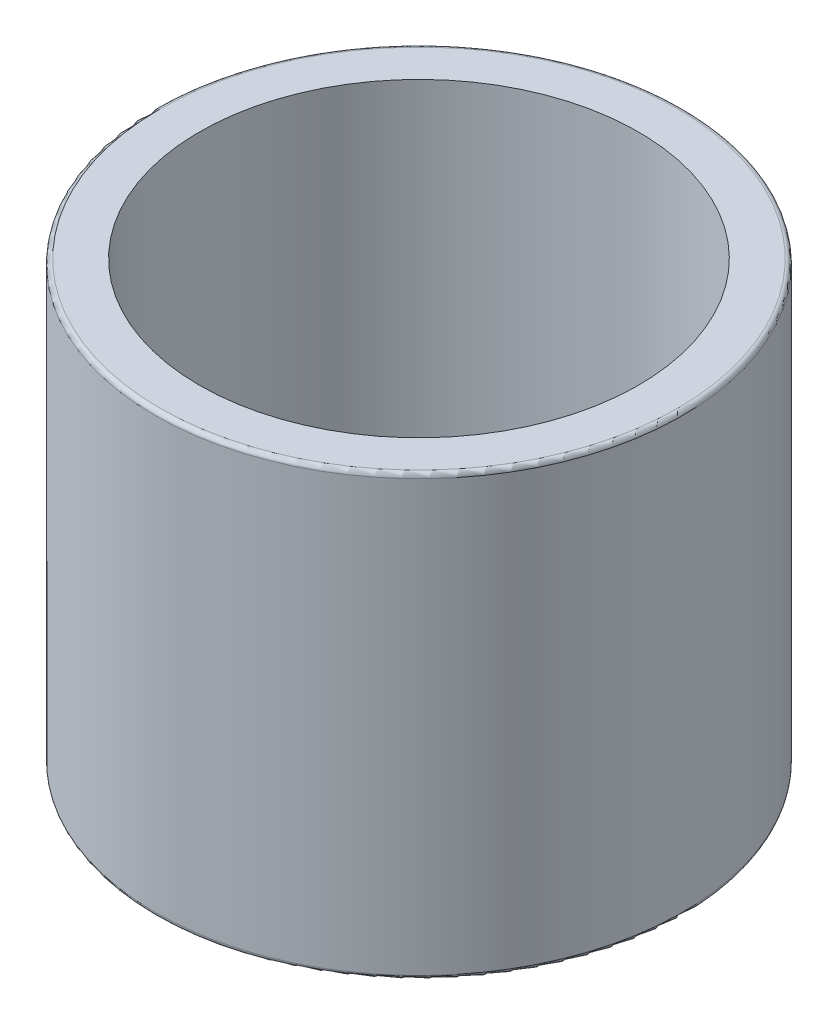
ISO-10303-21;
HEADER;
FILE_DESCRIPTION(('STEP AP214'),'2;1');
FILE_NAME('part.step','',(''),(''),'','','');
FILE_SCHEMA(('AUTOMOTIVE_DESIGN { 1 0 10303 214 1 1 1 1 }'));
ENDSEC;
DATA;
#1=APPLICATION_CONTEXT('core data for automotive mechanical design processes');
#2=APPLICATION_PROTOCOL_DEFINITION('international standard','automotive_design',2000,#1);
#3=PRODUCT_CONTEXT('',#1,'mechanical');
#4=PRODUCT('Part','Part','',(#3));
#5=PRODUCT_RELATED_PRODUCT_CATEGORY('part','',(#4));
#6=PRODUCT_DEFINITION_FORMATION('','',#4);
#7=PRODUCT_DEFINITION_CONTEXT('part definition',#1,'design');
#8=PRODUCT_DEFINITION('design','',#6,#7);
#9=PRODUCT_DEFINITION_SHAPE('','',#8);
#10=(LENGTH_UNIT() NAMED_UNIT(*) SI_UNIT(.MILLI.,.METRE.));
#11=(NAMED_UNIT(*) PLANE_ANGLE_UNIT() SI_UNIT($,.RADIAN.));
#12=(NAMED_UNIT(*) SI_UNIT($,.STERADIAN.) SOLID_ANGLE_UNIT());
#13=UNCERTAINTY_MEASURE_WITH_UNIT(LENGTH_MEASURE(1.E-05),#10,'distance_accuracy_value','');
#14=(GEOMETRIC_REPRESENTATION_CONTEXT(3) GLOBAL_UNCERTAINTY_ASSIGNED_CONTEXT((#13)) GLOBAL_UNIT_ASSIGNED_CONTEXT((#10,
#11,#12)) REPRESENTATION_CONTEXT('',''));
#15=CARTESIAN_POINT('',(0.,0.,0.));
#16=DIRECTION('',(0.,0.,1.));
#17=DIRECTION('',(1.,0.,0.));
#18=AXIS2_PLACEMENT_3D('',#15,#16,#17);
#19=CARTESIAN_POINT('',(0.,5.,0.));
#20=DIRECTION('',(0.,1.,0.));
#21=DIRECTION('',(0.,0.,1.));
#22=AXIS2_PLACEMENT_3D('',#19,#20,#21);
#23=PLANE('',#22);
#24=CARTESIAN_POINT('',(0.,5.,0.));
#25=DIRECTION('',(0.,1.,0.));
#26=DIRECTION('',(0.,0.,1.));
#27=AXIS2_PLACEMENT_3D('',#24,#25,#26);
#28=CIRCLE('',#27,5.9);
#29=CARTESIAN_POINT('',(0.,5.,5.9));
#30=VERTEX_POINT('',#29);
#31=EDGE_CURVE('E10',#30,#30,#28,.T.);
#32=ORIENTED_EDGE('',*,*,#31,.T.);
#33=EDGE_LOOP('',(#32));
#34=FACE_BOUND('',#33,.T.);
#35=CARTESIAN_POINT('',(0.,5.,0.));
#36=DIRECTION('',(0.,1.,0.));
#37=DIRECTION('',(0.,0.,1.));
#38=AXIS2_PLACEMENT_3D('',#35,#36,#37);
#39=CIRCLE('',#38,5.);
#40=CARTESIAN_POINT('',(0.,5.,5.));
#41=VERTEX_POINT('',#40);
#42=EDGE_CURVE('E53',#41,#41,#39,.T.);
#43=ORIENTED_EDGE('',*,*,#42,.F.);
#44=EDGE_LOOP('',(#43));
#45=FACE_BOUND('',#44,.T.);
#46=ADVANCED_FACE('F33',(#34,#45),#23,.T.);
#47=CARTESIAN_POINT('',(0.,-5.,0.));
#48=DIRECTION('',(0.,1.,0.));
#49=DIRECTION('',(0.,0.,1.));
#50=AXIS2_PLACEMENT_3D('',#47,#48,#49);
#51=PLANE('',#50);
#52=CARTESIAN_POINT('',(0.,-5.,0.));
#53=DIRECTION('',(0.,1.,0.));
#54=DIRECTION('',(0.,0.,1.));
#55=AXIS2_PLACEMENT_3D('',#52,#53,#54);
#56=CIRCLE('',#55,5.9);
#57=CARTESIAN_POINT('',(0.,-5.,5.9));
#58=VERTEX_POINT('',#57);
#59=EDGE_CURVE('E40',#58,#58,#56,.F.);
#60=ORIENTED_EDGE('',*,*,#59,.T.);
#61=EDGE_LOOP('',(#60));
#62=FACE_BOUND('',#61,.T.);
#63=CARTESIAN_POINT('',(0.,-5.,0.));
#64=DIRECTION('',(0.,1.,0.));
#65=DIRECTION('',(0.,0.,1.));
#66=AXIS2_PLACEMENT_3D('',#63,#64,#65);
#67=CIRCLE('',#66,5.);
#68=CARTESIAN_POINT('',(0.,-5.,5.));
#69=VERTEX_POINT('',#68);
#70=EDGE_CURVE('E54',#69,#69,#67,.T.);
#71=ORIENTED_EDGE('',*,*,#70,.T.);
#72=EDGE_LOOP('',(#71));
#73=FACE_BOUND('',#72,.T.);
#74=ADVANCED_FACE('F64',(#62,#73),#51,.F.);
#75=CARTESIAN_POINT('',(0.,5.,0.));
#76=DIRECTION('',(0.,-1.,0.));
#77=DIRECTION('',(0.,0.,-1.));
#78=AXIS2_PLACEMENT_3D('',#75,#76,#77);
#79=CYLINDRICAL_SURFACE('',#78,6.);
#80=CARTESIAN_POINT('',(0.,-4.9,0.));
#81=DIRECTION('',(0.,1.,0.));
#82=DIRECTION('',(0.,0.,1.));
#83=AXIS2_PLACEMENT_3D('',#80,#81,#82);
#84=CIRCLE('',#83,6.);
#85=CARTESIAN_POINT('',(0.,-4.9,6.));
#86=VERTEX_POINT('',#85);
#87=EDGE_CURVE('E44',#86,#86,#84,.T.);
#88=ORIENTED_EDGE('',*,*,#87,.T.);
#89=EDGE_LOOP('',(#88));
#90=FACE_BOUND('',#89,.T.);
#91=CARTESIAN_POINT('',(0.,4.9,0.));
#92=DIRECTION('',(0.,1.,0.));
#93=DIRECTION('',(0.,0.,1.));
#94=AXIS2_PLACEMENT_3D('',#91,#92,#93);
#95=CIRCLE('',#94,6.);
#96=CARTESIAN_POINT('',(0.,4.9,6.));
#97=VERTEX_POINT('',#96);
#98=EDGE_CURVE('E48',#97,#97,#95,.F.);
#99=ORIENTED_EDGE('',*,*,#98,.T.);
#100=EDGE_LOOP('',(#99));
#101=FACE_BOUND('',#100,.T.);
#102=ADVANCED_FACE('F69',(#90,#101),#79,.T.);
#103=CARTESIAN_POINT('',(0.,5.,0.));
#104=DIRECTION('',(0.,-1.,0.));
#105=DIRECTION('',(0.,0.,-1.));
#106=AXIS2_PLACEMENT_3D('',#103,#104,#105);
#107=CYLINDRICAL_SURFACE('',#106,5.);
#108=ORIENTED_EDGE('',*,*,#42,.T.);
#109=EDGE_LOOP('',(#108));
#110=FACE_BOUND('',#109,.T.);
#111=ORIENTED_EDGE('',*,*,#70,.F.);
#112=EDGE_LOOP('',(#111));
#113=FACE_BOUND('',#112,.T.);
#114=ADVANCED_FACE('F60',(#110,#113),#107,.F.);
#115=CARTESIAN_POINT('',(0.,-4.9,0.));
#116=DIRECTION('',(0.,1.,0.));
#117=DIRECTION('',(0.,0.,1.));
#118=AXIS2_PLACEMENT_3D('',#115,#116,#117);
#119=TOROIDAL_SURFACE('',#118,5.9,0.1);
#120=ORIENTED_EDGE('',*,*,#59,.F.);
#121=EDGE_LOOP('',(#120));
#122=FACE_BOUND('',#121,.T.);
#123=ORIENTED_EDGE('',*,*,#87,.F.);
#124=EDGE_LOOP('',(#123));
#125=FACE_BOUND('',#124,.T.);
#126=ADVANCED_FACE('F75',(#122,#125),#119,.T.);
#127=CARTESIAN_POINT('',(0.,4.9,0.));
#128=DIRECTION('',(0.,1.,0.));
#129=DIRECTION('',(0.,0.,1.));
#130=AXIS2_PLACEMENT_3D('',#127,#128,#129);
#131=TOROIDAL_SURFACE('',#130,5.9,0.1);
#132=ORIENTED_EDGE('',*,*,#98,.F.);
#133=EDGE_LOOP('',(#132));
#134=FACE_BOUND('',#133,.T.);
#135=ORIENTED_EDGE('',*,*,#31,.F.);
#136=EDGE_LOOP('',(#135));
#137=FACE_BOUND('',#136,.T.);
#138=ADVANCED_FACE('F35',(#134,#137),#131,.T.);
#139=CLOSED_SHELL('',(#46,#74,#102,#114,#126,#138));
#140=MANIFOLD_SOLID_BREP('B2',#139);
#141=ADVANCED_BREP_SHAPE_REPRESENTATION('',(#18,#140),#14);
#142=SHAPE_DEFINITION_REPRESENTATION(#9,#141);
ENDSEC;
END-ISO-10303-21;
